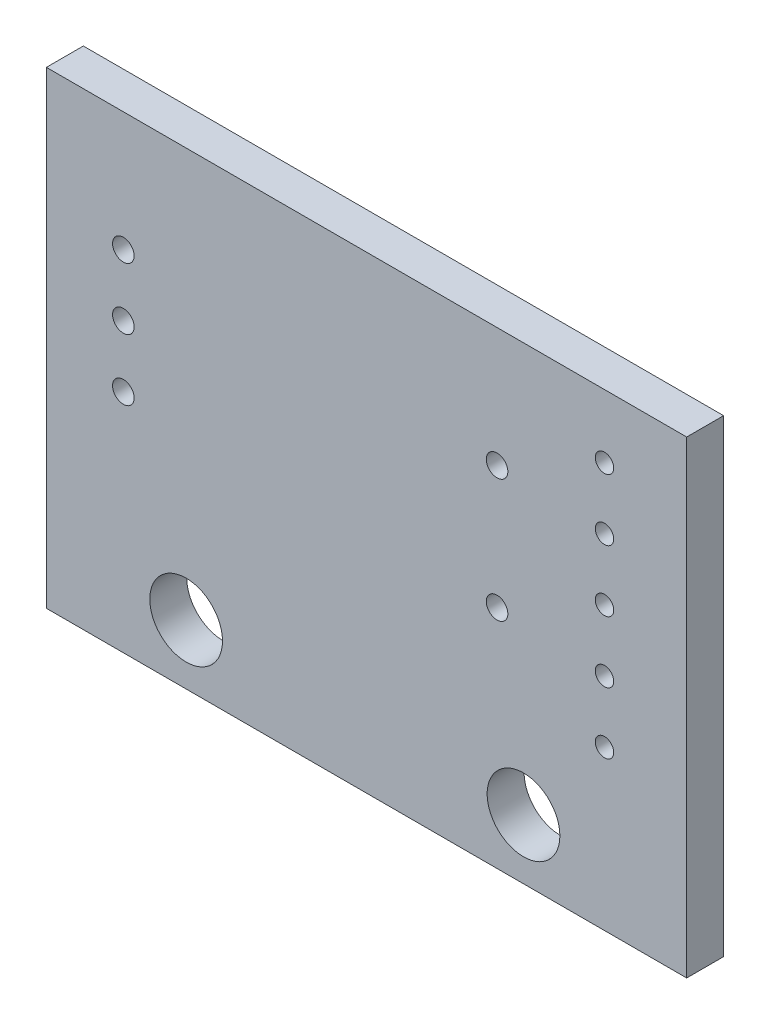
ISO-10303-21;
HEADER;
FILE_DESCRIPTION(('STEP AP214'),'2;1');
FILE_NAME('part.step','',(''),(''),'','','');
FILE_SCHEMA(('AUTOMOTIVE_DESIGN { 1 0 10303 214 1 1 1 1 }'));
ENDSEC;
DATA;
#1=APPLICATION_CONTEXT('core data for automotive mechanical design processes');
#2=APPLICATION_PROTOCOL_DEFINITION('international standard','automotive_design',2000,#1);
#3=PRODUCT_CONTEXT('',#1,'mechanical');
#4=PRODUCT('Part','Part','',(#3));
#5=PRODUCT_RELATED_PRODUCT_CATEGORY('part','',(#4));
#6=PRODUCT_DEFINITION_FORMATION('','',#4);
#7=PRODUCT_DEFINITION_CONTEXT('part definition',#1,'design');
#8=PRODUCT_DEFINITION('design','',#6,#7);
#9=PRODUCT_DEFINITION_SHAPE('','',#8);
#10=(LENGTH_UNIT() NAMED_UNIT(*) SI_UNIT(.MILLI.,.METRE.));
#11=(NAMED_UNIT(*) PLANE_ANGLE_UNIT() SI_UNIT($,.RADIAN.));
#12=(NAMED_UNIT(*) SI_UNIT($,.STERADIAN.) SOLID_ANGLE_UNIT());
#13=UNCERTAINTY_MEASURE_WITH_UNIT(LENGTH_MEASURE(1.E-05),#10,'distance_accuracy_value','');
#14=(GEOMETRIC_REPRESENTATION_CONTEXT(3) GLOBAL_UNCERTAINTY_ASSIGNED_CONTEXT((#13)) GLOBAL_UNIT_ASSIGNED_CONTEXT((#10,
#11,#12)) REPRESENTATION_CONTEXT('',''));
#15=CARTESIAN_POINT('',(0.,0.,0.));
#16=DIRECTION('',(0.,0.,1.));
#17=DIRECTION('',(1.,0.,0.));
#18=AXIS2_PLACEMENT_3D('',#15,#16,#17);
#19=CARTESIAN_POINT('',(13.208,9.6647,0.));
#20=DIRECTION('',(0.,0.,1.));
#21=DIRECTION('',(1.,0.,0.));
#22=AXIS2_PLACEMENT_3D('',#19,#20,#21);
#23=PLANE('',#22);
#24=DIRECTION('',(1.,0.,0.));
#25=VECTOR('',#24,1.);
#26=CARTESIAN_POINT('',(0.,0.,0.));
#27=LINE('',#26,#25);
#28=CARTESIAN_POINT('',(0.,0.,0.));
#29=VERTEX_POINT('',#28);
#30=CARTESIAN_POINT('',(26.416,0.,0.));
#31=VERTEX_POINT('',#30);
#32=EDGE_CURVE('E27',#29,#31,#27,.T.);
#33=ORIENTED_EDGE('',*,*,#32,.F.);
#34=DIRECTION('',(0.,-1.,0.));
#35=VECTOR('',#34,1.);
#36=CARTESIAN_POINT('',(0.,19.3294,0.));
#37=LINE('',#36,#35);
#38=CARTESIAN_POINT('',(0.,19.3294,0.));
#39=VERTEX_POINT('',#38);
#40=EDGE_CURVE('E151',#39,#29,#37,.T.);
#41=ORIENTED_EDGE('',*,*,#40,.F.);
#42=DIRECTION('',(-1.,0.,0.));
#43=VECTOR('',#42,1.);
#44=CARTESIAN_POINT('',(26.416,19.3294,0.));
#45=LINE('',#44,#43);
#46=CARTESIAN_POINT('',(26.416,19.3294,0.));
#47=VERTEX_POINT('',#46);
#48=EDGE_CURVE('E229',#47,#39,#45,.T.);
#49=ORIENTED_EDGE('',*,*,#48,.F.);
#50=DIRECTION('',(0.,1.,0.));
#51=VECTOR('',#50,1.);
#52=CARTESIAN_POINT('',(26.416,0.,0.));
#53=LINE('',#52,#51);
#54=EDGE_CURVE('E202',#31,#47,#53,.T.);
#55=ORIENTED_EDGE('',*,*,#54,.F.);
#56=EDGE_LOOP('',(#33,#41,#49,#55));
#57=FACE_BOUND('',#56,.T.);
#58=CARTESIAN_POINT('',(3.175,14.4018,0.));
#59=DIRECTION('',(0.,0.,1.));
#60=DIRECTION('',(-1.,0.,0.));
#61=AXIS2_PLACEMENT_3D('',#58,#59,#60);
#62=CIRCLE('',#61,0.4445);
#63=CARTESIAN_POINT('',(3.6195,14.4018,0.));
#64=VERTEX_POINT('',#63);
#65=EDGE_CURVE('E147',#64,#64,#62,.T.);
#66=ORIENTED_EDGE('',*,*,#65,.T.);
#67=EDGE_LOOP('',(#66));
#68=FACE_BOUND('',#67,.T.);
#69=CARTESIAN_POINT('',(3.175,11.8618,0.));
#70=DIRECTION('',(0.,0.,1.));
#71=DIRECTION('',(-1.,0.,0.));
#72=AXIS2_PLACEMENT_3D('',#69,#70,#71);
#73=CIRCLE('',#72,0.4445);
#74=CARTESIAN_POINT('',(3.6195,11.8618,0.));
#75=VERTEX_POINT('',#74);
#76=EDGE_CURVE('E161',#75,#75,#73,.T.);
#77=ORIENTED_EDGE('',*,*,#76,.T.);
#78=EDGE_LOOP('',(#77));
#79=FACE_BOUND('',#78,.T.);
#80=CARTESIAN_POINT('',(3.175,9.3218,0.));
#81=DIRECTION('',(0.,0.,1.));
#82=DIRECTION('',(-1.,0.,0.));
#83=AXIS2_PLACEMENT_3D('',#80,#81,#82);
#84=CIRCLE('',#83,0.4445);
#85=CARTESIAN_POINT('',(3.6195,9.3218,0.));
#86=VERTEX_POINT('',#85);
#87=EDGE_CURVE('E206',#86,#86,#84,.T.);
#88=ORIENTED_EDGE('',*,*,#87,.T.);
#89=EDGE_LOOP('',(#88));
#90=FACE_BOUND('',#89,.T.);
#91=CARTESIAN_POINT('',(5.7658,2.4638,0.));
#92=DIRECTION('',(0.,0.,1.));
#93=DIRECTION('',(-1.,0.,0.));
#94=AXIS2_PLACEMENT_3D('',#91,#92,#93);
#95=CIRCLE('',#94,1.5);
#96=CARTESIAN_POINT('',(7.2658,2.4638,0.));
#97=VERTEX_POINT('',#96);
#98=EDGE_CURVE('E165',#97,#97,#95,.T.);
#99=ORIENTED_EDGE('',*,*,#98,.T.);
#100=EDGE_LOOP('',(#99));
#101=FACE_BOUND('',#100,.T.);
#102=CARTESIAN_POINT('',(19.685,2.4638,0.));
#103=DIRECTION('',(0.,0.,1.));
#104=DIRECTION('',(-1.,0.,0.));
#105=AXIS2_PLACEMENT_3D('',#102,#103,#104);
#106=CIRCLE('',#105,1.5);
#107=CARTESIAN_POINT('',(21.185,2.4638,0.));
#108=VERTEX_POINT('',#107);
#109=EDGE_CURVE('E236',#108,#108,#106,.T.);
#110=ORIENTED_EDGE('',*,*,#109,.T.);
#111=EDGE_LOOP('',(#110));
#112=FACE_BOUND('',#111,.T.);
#113=CARTESIAN_POINT('',(23.0251,6.5532,0.));
#114=DIRECTION('',(0.,0.,1.));
#115=DIRECTION('',(-1.,0.,0.));
#116=AXIS2_PLACEMENT_3D('',#113,#114,#115);
#117=CIRCLE('',#116,0.381);
#118=CARTESIAN_POINT('',(23.4061,6.5532,0.));
#119=VERTEX_POINT('',#118);
#120=EDGE_CURVE('E212',#119,#119,#117,.T.);
#121=ORIENTED_EDGE('',*,*,#120,.T.);
#122=EDGE_LOOP('',(#121));
#123=FACE_BOUND('',#122,.T.);
#124=CARTESIAN_POINT('',(23.0251,9.0932,0.));
#125=DIRECTION('',(0.,0.,1.));
#126=DIRECTION('',(-1.,0.,0.));
#127=AXIS2_PLACEMENT_3D('',#124,#125,#126);
#128=CIRCLE('',#127,0.381);
#129=CARTESIAN_POINT('',(23.4061,9.0932,0.));
#130=VERTEX_POINT('',#129);
#131=EDGE_CURVE('E181',#130,#130,#128,.T.);
#132=ORIENTED_EDGE('',*,*,#131,.T.);
#133=EDGE_LOOP('',(#132));
#134=FACE_BOUND('',#133,.T.);
#135=CARTESIAN_POINT('',(23.0251,11.6332,0.));
#136=DIRECTION('',(0.,0.,1.));
#137=DIRECTION('',(-1.,0.,0.));
#138=AXIS2_PLACEMENT_3D('',#135,#136,#137);
#139=CIRCLE('',#138,0.381);
#140=CARTESIAN_POINT('',(23.4061,11.6332,0.));
#141=VERTEX_POINT('',#140);
#142=EDGE_CURVE('E179',#141,#141,#139,.T.);
#143=ORIENTED_EDGE('',*,*,#142,.T.);
#144=EDGE_LOOP('',(#143));
#145=FACE_BOUND('',#144,.T.);
#146=CARTESIAN_POINT('',(23.0251,14.1732,0.));
#147=DIRECTION('',(0.,0.,1.));
#148=DIRECTION('',(-1.,0.,0.));
#149=AXIS2_PLACEMENT_3D('',#146,#147,#148);
#150=CIRCLE('',#149,0.381);
#151=CARTESIAN_POINT('',(23.4061,14.1732,0.));
#152=VERTEX_POINT('',#151);
#153=EDGE_CURVE('E180',#152,#152,#150,.T.);
#154=ORIENTED_EDGE('',*,*,#153,.T.);
#155=EDGE_LOOP('',(#154));
#156=FACE_BOUND('',#155,.T.);
#157=CARTESIAN_POINT('',(23.0251,16.7132,0.));
#158=DIRECTION('',(0.,0.,1.));
#159=DIRECTION('',(-1.,0.,0.));
#160=AXIS2_PLACEMENT_3D('',#157,#158,#159);
#161=CIRCLE('',#160,0.381);
#162=CARTESIAN_POINT('',(23.4061,16.7132,0.));
#163=VERTEX_POINT('',#162);
#164=EDGE_CURVE('E173',#163,#163,#161,.T.);
#165=ORIENTED_EDGE('',*,*,#164,.T.);
#166=EDGE_LOOP('',(#165));
#167=FACE_BOUND('',#166,.T.);
#168=CARTESIAN_POINT('',(18.5930357428693,9.3218,0.));
#169=DIRECTION('',(0.,0.,1.));
#170=DIRECTION('',(1.,0.,0.));
#171=AXIS2_PLACEMENT_3D('',#168,#169,#170);
#172=CIRCLE('',#171,0.4445);
#173=CARTESIAN_POINT('',(18.1485357428693,9.3218,0.));
#174=VERTEX_POINT('',#173);
#175=EDGE_CURVE('E194',#174,#174,#172,.T.);
#176=ORIENTED_EDGE('',*,*,#175,.T.);
#177=EDGE_LOOP('',(#176));
#178=FACE_BOUND('',#177,.T.);
#179=CARTESIAN_POINT('',(18.5930357428693,14.4018,0.));
#180=DIRECTION('',(0.,0.,1.));
#181=DIRECTION('',(1.,0.,0.));
#182=AXIS2_PLACEMENT_3D('',#179,#180,#181);
#183=CIRCLE('',#182,0.4445);
#184=CARTESIAN_POINT('',(18.1485357428693,14.4018,0.));
#185=VERTEX_POINT('',#184);
#186=EDGE_CURVE('E189',#185,#185,#183,.T.);
#187=ORIENTED_EDGE('',*,*,#186,.T.);
#188=EDGE_LOOP('',(#187));
#189=FACE_BOUND('',#188,.T.);
#190=ADVANCED_FACE('F16',(#57,#68,#79,#90,#101,#112,#123,#134,#145,#156,#167,#178,#189),#23,.F.);
#191=CARTESIAN_POINT('',(13.208,9.6647,1.524));
#192=DIRECTION('',(0.,0.,1.));
#193=DIRECTION('',(1.,0.,0.));
#194=AXIS2_PLACEMENT_3D('',#191,#192,#193);
#195=PLANE('',#194);
#196=DIRECTION('',(1.,0.,0.));
#197=VECTOR('',#196,1.);
#198=CARTESIAN_POINT('',(0.,0.,1.524));
#199=LINE('',#198,#197);
#200=CARTESIAN_POINT('',(0.,0.,1.524));
#201=VERTEX_POINT('',#200);
#202=CARTESIAN_POINT('',(26.416,0.,1.524));
#203=VERTEX_POINT('',#202);
#204=EDGE_CURVE('E10',#201,#203,#199,.T.);
#205=ORIENTED_EDGE('',*,*,#204,.T.);
#206=DIRECTION('',(0.,1.,0.));
#207=VECTOR('',#206,1.);
#208=CARTESIAN_POINT('',(26.416,0.,1.524));
#209=LINE('',#208,#207);
#210=CARTESIAN_POINT('',(26.416,19.3294,1.524));
#211=VERTEX_POINT('',#210);
#212=EDGE_CURVE('E199',#203,#211,#209,.T.);
#213=ORIENTED_EDGE('',*,*,#212,.T.);
#214=DIRECTION('',(-1.,0.,0.));
#215=VECTOR('',#214,1.);
#216=CARTESIAN_POINT('',(26.416,19.3294,1.524));
#217=LINE('',#216,#215);
#218=CARTESIAN_POINT('',(0.,19.3294,1.524));
#219=VERTEX_POINT('',#218);
#220=EDGE_CURVE('E211',#211,#219,#217,.T.);
#221=ORIENTED_EDGE('',*,*,#220,.T.);
#222=DIRECTION('',(0.,-1.,0.));
#223=VECTOR('',#222,1.);
#224=CARTESIAN_POINT('',(0.,19.3294,1.524));
#225=LINE('',#224,#223);
#226=EDGE_CURVE('E230',#219,#201,#225,.T.);
#227=ORIENTED_EDGE('',*,*,#226,.T.);
#228=EDGE_LOOP('',(#205,#213,#221,#227));
#229=FACE_BOUND('',#228,.T.);
#230=CARTESIAN_POINT('',(3.175,14.4018,1.524));
#231=DIRECTION('',(0.,0.,-1.));
#232=DIRECTION('',(-1.,0.,0.));
#233=AXIS2_PLACEMENT_3D('',#230,#231,#232);
#234=CIRCLE('',#233,0.4445);
#235=CARTESIAN_POINT('',(3.6195,14.4018,1.524));
#236=VERTEX_POINT('',#235);
#237=EDGE_CURVE('E152',#236,#236,#234,.T.);
#238=ORIENTED_EDGE('',*,*,#237,.T.);
#239=EDGE_LOOP('',(#238));
#240=FACE_BOUND('',#239,.T.);
#241=CARTESIAN_POINT('',(3.175,11.8618,1.524));
#242=DIRECTION('',(0.,0.,-1.));
#243=DIRECTION('',(-1.,0.,0.));
#244=AXIS2_PLACEMENT_3D('',#241,#242,#243);
#245=CIRCLE('',#244,0.4445);
#246=CARTESIAN_POINT('',(3.6195,11.8618,1.524));
#247=VERTEX_POINT('',#246);
#248=EDGE_CURVE('E203',#247,#247,#245,.T.);
#249=ORIENTED_EDGE('',*,*,#248,.T.);
#250=EDGE_LOOP('',(#249));
#251=FACE_BOUND('',#250,.T.);
#252=CARTESIAN_POINT('',(3.175,9.3218,1.524));
#253=DIRECTION('',(0.,0.,-1.));
#254=DIRECTION('',(-1.,0.,0.));
#255=AXIS2_PLACEMENT_3D('',#252,#253,#254);
#256=CIRCLE('',#255,0.4445);
#257=CARTESIAN_POINT('',(3.6195,9.3218,1.524));
#258=VERTEX_POINT('',#257);
#259=EDGE_CURVE('E168',#258,#258,#256,.T.);
#260=ORIENTED_EDGE('',*,*,#259,.T.);
#261=EDGE_LOOP('',(#260));
#262=FACE_BOUND('',#261,.T.);
#263=CARTESIAN_POINT('',(5.7658,2.4638,1.524));
#264=DIRECTION('',(0.,0.,-1.));
#265=DIRECTION('',(-1.,0.,0.));
#266=AXIS2_PLACEMENT_3D('',#263,#264,#265);
#267=CIRCLE('',#266,1.5);
#268=CARTESIAN_POINT('',(7.2658,2.4638,1.524));
#269=VERTEX_POINT('',#268);
#270=EDGE_CURVE('E169',#269,#269,#267,.T.);
#271=ORIENTED_EDGE('',*,*,#270,.T.);
#272=EDGE_LOOP('',(#271));
#273=FACE_BOUND('',#272,.T.);
#274=CARTESIAN_POINT('',(19.685,2.4638,1.524));
#275=DIRECTION('',(0.,0.,-1.));
#276=DIRECTION('',(-1.,0.,0.));
#277=AXIS2_PLACEMENT_3D('',#274,#275,#276);
#278=CIRCLE('',#277,1.5);
#279=CARTESIAN_POINT('',(21.185,2.4638,1.524));
#280=VERTEX_POINT('',#279);
#281=EDGE_CURVE('E20',#280,#280,#278,.T.);
#282=ORIENTED_EDGE('',*,*,#281,.T.);
#283=EDGE_LOOP('',(#282));
#284=FACE_BOUND('',#283,.T.);
#285=CARTESIAN_POINT('',(23.0251,6.5532,1.524));
#286=DIRECTION('',(0.,0.,-1.));
#287=DIRECTION('',(-1.,0.,0.));
#288=AXIS2_PLACEMENT_3D('',#285,#286,#287);
#289=CIRCLE('',#288,0.381);
#290=CARTESIAN_POINT('',(23.4061,6.5532,1.524));
#291=VERTEX_POINT('',#290);
#292=EDGE_CURVE('E184',#291,#291,#289,.T.);
#293=ORIENTED_EDGE('',*,*,#292,.T.);
#294=EDGE_LOOP('',(#293));
#295=FACE_BOUND('',#294,.T.);
#296=CARTESIAN_POINT('',(23.0251,9.0932,1.524));
#297=DIRECTION('',(0.,0.,-1.));
#298=DIRECTION('',(-1.,0.,0.));
#299=AXIS2_PLACEMENT_3D('',#296,#297,#298);
#300=CIRCLE('',#299,0.381);
#301=CARTESIAN_POINT('',(23.4061,9.0932,1.524));
#302=VERTEX_POINT('',#301);
#303=EDGE_CURVE('E185',#302,#302,#300,.T.);
#304=ORIENTED_EDGE('',*,*,#303,.T.);
#305=EDGE_LOOP('',(#304));
#306=FACE_BOUND('',#305,.T.);
#307=CARTESIAN_POINT('',(23.0251,11.6332,1.524));
#308=DIRECTION('',(0.,0.,-1.));
#309=DIRECTION('',(-1.,0.,0.));
#310=AXIS2_PLACEMENT_3D('',#307,#308,#309);
#311=CIRCLE('',#310,0.381);
#312=CARTESIAN_POINT('',(23.4061,11.6332,1.524));
#313=VERTEX_POINT('',#312);
#314=EDGE_CURVE('E175',#313,#313,#311,.T.);
#315=ORIENTED_EDGE('',*,*,#314,.T.);
#316=EDGE_LOOP('',(#315));
#317=FACE_BOUND('',#316,.T.);
#318=CARTESIAN_POINT('',(23.0251,14.1732,1.524));
#319=DIRECTION('',(0.,0.,-1.));
#320=DIRECTION('',(-1.,0.,0.));
#321=AXIS2_PLACEMENT_3D('',#318,#319,#320);
#322=CIRCLE('',#321,0.381);
#323=CARTESIAN_POINT('',(23.4061,14.1732,1.524));
#324=VERTEX_POINT('',#323);
#325=EDGE_CURVE('E217',#324,#324,#322,.T.);
#326=ORIENTED_EDGE('',*,*,#325,.T.);
#327=EDGE_LOOP('',(#326));
#328=FACE_BOUND('',#327,.T.);
#329=CARTESIAN_POINT('',(23.0251,16.7132,1.524));
#330=DIRECTION('',(0.,0.,-1.));
#331=DIRECTION('',(-1.,0.,0.));
#332=AXIS2_PLACEMENT_3D('',#329,#330,#331);
#333=CIRCLE('',#332,0.381);
#334=CARTESIAN_POINT('',(23.4061,16.7132,1.524));
#335=VERTEX_POINT('',#334);
#336=EDGE_CURVE('E170',#335,#335,#333,.T.);
#337=ORIENTED_EDGE('',*,*,#336,.T.);
#338=EDGE_LOOP('',(#337));
#339=FACE_BOUND('',#338,.T.);
#340=CARTESIAN_POINT('',(18.5930357428693,9.3218,1.524));
#341=DIRECTION('',(0.,0.,-1.));
#342=DIRECTION('',(1.,0.,0.));
#343=AXIS2_PLACEMENT_3D('',#340,#341,#342);
#344=CIRCLE('',#343,0.4445);
#345=CARTESIAN_POINT('',(19.0375357428693,9.3218,1.524));
#346=VERTEX_POINT('',#345);
#347=EDGE_CURVE('E174',#346,#346,#344,.T.);
#348=ORIENTED_EDGE('',*,*,#347,.T.);
#349=EDGE_LOOP('',(#348));
#350=FACE_BOUND('',#349,.T.);
#351=CARTESIAN_POINT('',(18.5930357428693,14.4018,1.524));
#352=DIRECTION('',(0.,0.,-1.));
#353=DIRECTION('',(1.,0.,0.));
#354=AXIS2_PLACEMENT_3D('',#351,#352,#353);
#355=CIRCLE('',#354,0.4445);
#356=CARTESIAN_POINT('',(19.0375357428693,14.4018,1.524));
#357=VERTEX_POINT('',#356);
#358=EDGE_CURVE('E193',#357,#357,#355,.T.);
#359=ORIENTED_EDGE('',*,*,#358,.T.);
#360=EDGE_LOOP('',(#359));
#361=FACE_BOUND('',#360,.T.);
#362=ADVANCED_FACE('F266',(#229,#240,#251,#262,#273,#284,#295,#306,#317,#328,#339,#350,#361),
#195,.T.);
#363=CARTESIAN_POINT('',(0.,0.,0.));
#364=DIRECTION('',(0.,-1.,0.));
#365=DIRECTION('',(0.,0.,-1.));
#366=AXIS2_PLACEMENT_3D('',#363,#364,#365);
#367=PLANE('',#366);
#368=ORIENTED_EDGE('',*,*,#32,.T.);
#369=DIRECTION('',(0.,0.,1.));
#370=VECTOR('',#369,1.);
#371=CARTESIAN_POINT('',(26.416,0.,0.));
#372=LINE('',#371,#370);
#373=EDGE_CURVE('E188',#31,#203,#372,.T.);
#374=ORIENTED_EDGE('',*,*,#373,.T.);
#375=ORIENTED_EDGE('',*,*,#204,.F.);
#376=DIRECTION('',(0.,0.,1.));
#377=VECTOR('',#376,1.);
#378=CARTESIAN_POINT('',(0.,0.,0.));
#379=LINE('',#378,#377);
#380=EDGE_CURVE('E158',#29,#201,#379,.T.);
#381=ORIENTED_EDGE('',*,*,#380,.F.);
#382=EDGE_LOOP('',(#368,#374,#375,#381));
#383=FACE_BOUND('',#382,.T.);
#384=ADVANCED_FACE('F269',(#383),#367,.T.);
#385=CARTESIAN_POINT('',(26.416,0.,0.));
#386=DIRECTION('',(1.,0.,0.));
#387=DIRECTION('',(0.,1.,0.));
#388=AXIS2_PLACEMENT_3D('',#385,#386,#387);
#389=PLANE('',#388);
#390=ORIENTED_EDGE('',*,*,#54,.T.);
#391=DIRECTION('',(0.,0.,1.));
#392=VECTOR('',#391,1.);
#393=CARTESIAN_POINT('',(26.416,19.3294,0.));
#394=LINE('',#393,#392);
#395=EDGE_CURVE('E207',#47,#211,#394,.T.);
#396=ORIENTED_EDGE('',*,*,#395,.T.);
#397=ORIENTED_EDGE('',*,*,#212,.F.);
#398=ORIENTED_EDGE('',*,*,#373,.F.);
#399=EDGE_LOOP('',(#390,#396,#397,#398));
#400=FACE_BOUND('',#399,.T.);
#401=ADVANCED_FACE('F310',(#400),#389,.T.);
#402=CARTESIAN_POINT('',(26.416,19.3294,0.));
#403=DIRECTION('',(0.,1.,0.));
#404=DIRECTION('',(1.,0.,0.));
#405=AXIS2_PLACEMENT_3D('',#402,#403,#404);
#406=PLANE('',#405);
#407=ORIENTED_EDGE('',*,*,#48,.T.);
#408=DIRECTION('',(0.,0.,1.));
#409=VECTOR('',#408,1.);
#410=CARTESIAN_POINT('',(0.,19.3294,0.));
#411=LINE('',#410,#409);
#412=EDGE_CURVE('E225',#39,#219,#411,.T.);
#413=ORIENTED_EDGE('',*,*,#412,.T.);
#414=ORIENTED_EDGE('',*,*,#220,.F.);
#415=ORIENTED_EDGE('',*,*,#395,.F.);
#416=EDGE_LOOP('',(#407,#413,#414,#415));
#417=FACE_BOUND('',#416,.T.);
#418=ADVANCED_FACE('F18',(#417),#406,.T.);
#419=CARTESIAN_POINT('',(0.,19.3294,0.));
#420=DIRECTION('',(-1.,0.,0.));
#421=DIRECTION('',(0.,0.,1.));
#422=AXIS2_PLACEMENT_3D('',#419,#420,#421);
#423=PLANE('',#422);
#424=ORIENTED_EDGE('',*,*,#40,.T.);
#425=ORIENTED_EDGE('',*,*,#380,.T.);
#426=ORIENTED_EDGE('',*,*,#226,.F.);
#427=ORIENTED_EDGE('',*,*,#412,.F.);
#428=EDGE_LOOP('',(#424,#425,#426,#427));
#429=FACE_BOUND('',#428,.T.);
#430=ADVANCED_FACE('F330',(#429),#423,.T.);
#431=CARTESIAN_POINT('',(3.175,14.4018,0.));
#432=DIRECTION('',(0.,0.,1.));
#433=DIRECTION('',(-1.,0.,0.));
#434=AXIS2_PLACEMENT_3D('',#431,#432,#433);
#435=CYLINDRICAL_SURFACE('',#434,0.4445);
#436=ORIENTED_EDGE('',*,*,#65,.F.);
#437=EDGE_LOOP('',(#436));
#438=FACE_BOUND('',#437,.T.);
#439=ORIENTED_EDGE('',*,*,#237,.F.);
#440=EDGE_LOOP('',(#439));
#441=FACE_BOUND('',#440,.T.);
#442=ADVANCED_FACE('F437',(#438,#441),#435,.F.);
#443=CARTESIAN_POINT('',(3.175,11.8618,0.));
#444=DIRECTION('',(0.,0.,1.));
#445=DIRECTION('',(-1.,0.,0.));
#446=AXIS2_PLACEMENT_3D('',#443,#444,#445);
#447=CYLINDRICAL_SURFACE('',#446,0.4445);
#448=ORIENTED_EDGE('',*,*,#76,.F.);
#449=EDGE_LOOP('',(#448));
#450=FACE_BOUND('',#449,.T.);
#451=ORIENTED_EDGE('',*,*,#248,.F.);
#452=EDGE_LOOP('',(#451));
#453=FACE_BOUND('',#452,.T.);
#454=ADVANCED_FACE('F262',(#450,#453),#447,.F.);
#455=CARTESIAN_POINT('',(3.175,9.3218,0.));
#456=DIRECTION('',(0.,0.,1.));
#457=DIRECTION('',(-1.,0.,0.));
#458=AXIS2_PLACEMENT_3D('',#455,#456,#457);
#459=CYLINDRICAL_SURFACE('',#458,0.4445);
#460=ORIENTED_EDGE('',*,*,#87,.F.);
#461=EDGE_LOOP('',(#460));
#462=FACE_BOUND('',#461,.T.);
#463=ORIENTED_EDGE('',*,*,#259,.F.);
#464=EDGE_LOOP('',(#463));
#465=FACE_BOUND('',#464,.T.);
#466=ADVANCED_FACE('F258',(#462,#465),#459,.F.);
#467=CARTESIAN_POINT('',(5.7658,2.4638,0.));
#468=DIRECTION('',(0.,0.,1.));
#469=DIRECTION('',(-1.,0.,0.));
#470=AXIS2_PLACEMENT_3D('',#467,#468,#469);
#471=CYLINDRICAL_SURFACE('',#470,1.5);
#472=ORIENTED_EDGE('',*,*,#98,.F.);
#473=EDGE_LOOP('',(#472));
#474=FACE_BOUND('',#473,.T.);
#475=ORIENTED_EDGE('',*,*,#270,.F.);
#476=EDGE_LOOP('',(#475));
#477=FACE_BOUND('',#476,.T.);
#478=ADVANCED_FACE('F261',(#474,#477),#471,.F.);
#479=CARTESIAN_POINT('',(19.685,2.4638,0.));
#480=DIRECTION('',(0.,0.,1.));
#481=DIRECTION('',(-1.,0.,0.));
#482=AXIS2_PLACEMENT_3D('',#479,#480,#481);
#483=CYLINDRICAL_SURFACE('',#482,1.5);
#484=ORIENTED_EDGE('',*,*,#109,.F.);
#485=EDGE_LOOP('',(#484));
#486=FACE_BOUND('',#485,.T.);
#487=ORIENTED_EDGE('',*,*,#281,.F.);
#488=EDGE_LOOP('',(#487));
#489=FACE_BOUND('',#488,.T.);
#490=ADVANCED_FACE('F307',(#486,#489),#483,.F.);
#491=CARTESIAN_POINT('',(23.0251,6.5532,0.));
#492=DIRECTION('',(0.,0.,1.));
#493=DIRECTION('',(-1.,0.,0.));
#494=AXIS2_PLACEMENT_3D('',#491,#492,#493);
#495=CYLINDRICAL_SURFACE('',#494,0.381);
#496=ORIENTED_EDGE('',*,*,#120,.F.);
#497=EDGE_LOOP('',(#496));
#498=FACE_BOUND('',#497,.T.);
#499=ORIENTED_EDGE('',*,*,#292,.F.);
#500=EDGE_LOOP('',(#499));
#501=FACE_BOUND('',#500,.T.);
#502=ADVANCED_FACE('F413',(#498,#501),#495,.F.);
#503=CARTESIAN_POINT('',(23.0251,9.0932,0.));
#504=DIRECTION('',(0.,0.,1.));
#505=DIRECTION('',(-1.,0.,0.));
#506=AXIS2_PLACEMENT_3D('',#503,#504,#505);
#507=CYLINDRICAL_SURFACE('',#506,0.381);
#508=ORIENTED_EDGE('',*,*,#131,.F.);
#509=EDGE_LOOP('',(#508));
#510=FACE_BOUND('',#509,.T.);
#511=ORIENTED_EDGE('',*,*,#303,.F.);
#512=EDGE_LOOP('',(#511));
#513=FACE_BOUND('',#512,.T.);
#514=ADVANCED_FACE('F410',(#510,#513),#507,.F.);
#515=CARTESIAN_POINT('',(23.0251,11.6332,0.));
#516=DIRECTION('',(0.,0.,1.));
#517=DIRECTION('',(-1.,0.,0.));
#518=AXIS2_PLACEMENT_3D('',#515,#516,#517);
#519=CYLINDRICAL_SURFACE('',#518,0.381);
#520=ORIENTED_EDGE('',*,*,#142,.F.);
#521=EDGE_LOOP('',(#520));
#522=FACE_BOUND('',#521,.T.);
#523=ORIENTED_EDGE('',*,*,#314,.F.);
#524=EDGE_LOOP('',(#523));
#525=FACE_BOUND('',#524,.T.);
#526=ADVANCED_FACE('F412',(#522,#525),#519,.F.);
#527=CARTESIAN_POINT('',(23.0251,14.1732,0.));
#528=DIRECTION('',(0.,0.,1.));
#529=DIRECTION('',(-1.,0.,0.));
#530=AXIS2_PLACEMENT_3D('',#527,#528,#529);
#531=CYLINDRICAL_SURFACE('',#530,0.381);
#532=ORIENTED_EDGE('',*,*,#153,.F.);
#533=EDGE_LOOP('',(#532));
#534=FACE_BOUND('',#533,.T.);
#535=ORIENTED_EDGE('',*,*,#325,.F.);
#536=EDGE_LOOP('',(#535));
#537=FACE_BOUND('',#536,.T.);
#538=ADVANCED_FACE('F405',(#534,#537),#531,.F.);
#539=CARTESIAN_POINT('',(23.0251,16.7132,0.));
#540=DIRECTION('',(0.,0.,1.));
#541=DIRECTION('',(-1.,0.,0.));
#542=AXIS2_PLACEMENT_3D('',#539,#540,#541);
#543=CYLINDRICAL_SURFACE('',#542,0.381);
#544=ORIENTED_EDGE('',*,*,#164,.F.);
#545=EDGE_LOOP('',(#544));
#546=FACE_BOUND('',#545,.T.);
#547=ORIENTED_EDGE('',*,*,#336,.F.);
#548=EDGE_LOOP('',(#547));
#549=FACE_BOUND('',#548,.T.);
#550=ADVANCED_FACE('F399',(#546,#549),#543,.F.);
#551=CARTESIAN_POINT('',(18.5930357428693,9.3218,-31.2441756642019));
#552=DIRECTION('',(0.,0.,1.));
#553=DIRECTION('',(1.,0.,0.));
#554=AXIS2_PLACEMENT_3D('',#551,#552,#553);
#555=CYLINDRICAL_SURFACE('',#554,0.4445);
#556=ORIENTED_EDGE('',*,*,#347,.F.);
#557=EDGE_LOOP('',(#556));
#558=FACE_BOUND('',#557,.T.);
#559=ORIENTED_EDGE('',*,*,#175,.F.);
#560=EDGE_LOOP('',(#559));
#561=FACE_BOUND('',#560,.T.);
#562=ADVANCED_FACE('F292',(#558,#561),#555,.F.);
#563=CARTESIAN_POINT('',(18.5930357428693,14.4018,-31.2441756642019));
#564=DIRECTION('',(0.,0.,1.));
#565=DIRECTION('',(1.,0.,0.));
#566=AXIS2_PLACEMENT_3D('',#563,#564,#565);
#567=CYLINDRICAL_SURFACE('',#566,0.4445);
#568=ORIENTED_EDGE('',*,*,#358,.F.);
#569=EDGE_LOOP('',(#568));
#570=FACE_BOUND('',#569,.T.);
#571=ORIENTED_EDGE('',*,*,#186,.F.);
#572=EDGE_LOOP('',(#571));
#573=FACE_BOUND('',#572,.T.);
#574=ADVANCED_FACE('F289',(#570,#573),#567,.F.);
#575=CLOSED_SHELL('',(#190,#362,#384,#401,#418,#430,#442,#454,#466,#478,#490,#502,#514,#526,
#538,#550,#562,#574));
#576=MANIFOLD_SOLID_BREP('B1',#575);
#577=ADVANCED_BREP_SHAPE_REPRESENTATION('',(#18,#576),#14);
#578=SHAPE_DEFINITION_REPRESENTATION(#9,#577);
ENDSEC;
END-ISO-10303-21;
